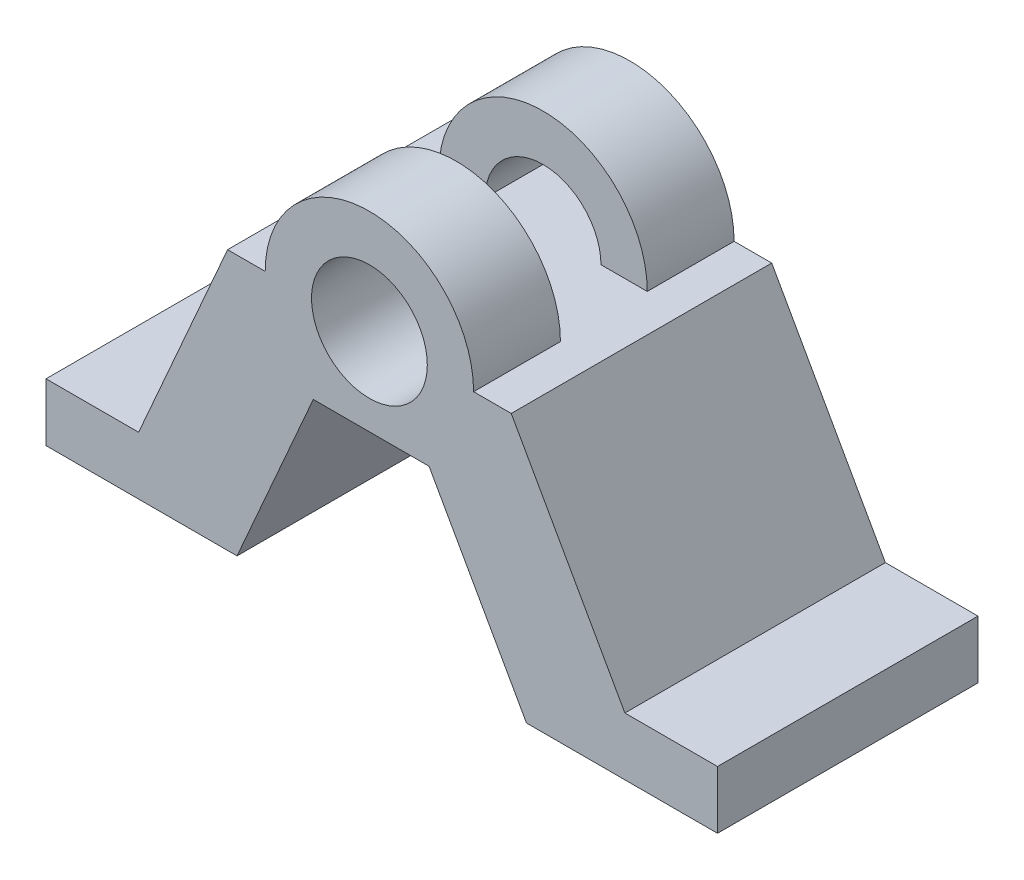
ISO-10303-21;
HEADER;
FILE_DESCRIPTION(('STEP AP214'),'2;1');
FILE_NAME('part.step','',(''),(''),'','','');
FILE_SCHEMA(('AUTOMOTIVE_DESIGN { 1 0 10303 214 1 1 1 1 }'));
ENDSEC;
DATA;
#1=APPLICATION_CONTEXT('core data for automotive mechanical design processes');
#2=APPLICATION_PROTOCOL_DEFINITION('international standard','automotive_design',2000,#1);
#3=PRODUCT_CONTEXT('',#1,'mechanical');
#4=PRODUCT('Part','Part','',(#3));
#5=PRODUCT_RELATED_PRODUCT_CATEGORY('part','',(#4));
#6=PRODUCT_DEFINITION_FORMATION('','',#4);
#7=PRODUCT_DEFINITION_CONTEXT('part definition',#1,'design');
#8=PRODUCT_DEFINITION('design','',#6,#7);
#9=PRODUCT_DEFINITION_SHAPE('','',#8);
#10=(LENGTH_UNIT() NAMED_UNIT(*) SI_UNIT(.MILLI.,.METRE.));
#11=(NAMED_UNIT(*) PLANE_ANGLE_UNIT() SI_UNIT($,.RADIAN.));
#12=(NAMED_UNIT(*) SI_UNIT($,.STERADIAN.) SOLID_ANGLE_UNIT());
#13=UNCERTAINTY_MEASURE_WITH_UNIT(LENGTH_MEASURE(1.E-05),#10,'distance_accuracy_value','');
#14=(GEOMETRIC_REPRESENTATION_CONTEXT(3) GLOBAL_UNCERTAINTY_ASSIGNED_CONTEXT((#13)) GLOBAL_UNIT_ASSIGNED_CONTEXT((#10,
#11,#12)) REPRESENTATION_CONTEXT('',''));
#15=CARTESIAN_POINT('',(0.,0.,0.));
#16=DIRECTION('',(0.,0.,1.));
#17=DIRECTION('',(1.,0.,0.));
#18=AXIS2_PLACEMENT_3D('',#15,#16,#17);
#19=CARTESIAN_POINT('',(0.,35.,-30.));
#20=DIRECTION('',(0.,-1.,0.));
#21=DIRECTION('',(1.,0.,0.));
#22=AXIS2_PLACEMENT_3D('',#19,#20,#21);
#23=PLANE('',#22);
#24=DIRECTION('',(-1.,0.,0.));
#25=VECTOR('',#24,1.);
#26=CARTESIAN_POINT('',(0.,35.,-15.));
#27=LINE('',#26,#25);
#28=CARTESIAN_POINT('',(2.69339881732652,35.,-15.));
#29=VERTEX_POINT('',#28);
#30=CARTESIAN_POINT('',(-17.3066011826735,35.,-15.));
#31=VERTEX_POINT('',#30);
#32=EDGE_CURVE('E169',#29,#31,#27,.T.);
#33=ORIENTED_EDGE('',*,*,#32,.F.);
#34=DIRECTION('',(-1.,0.,0.));
#35=VECTOR('',#34,1.);
#36=CARTESIAN_POINT('',(0.,35.,-15.));
#37=LINE('',#36,#35);
#38=CARTESIAN_POINT('',(10.6933988173265,35.,-15.));
#39=VERTEX_POINT('',#38);
#40=EDGE_CURVE('E188',#39,#29,#37,.T.);
#41=ORIENTED_EDGE('',*,*,#40,.F.);
#42=DIRECTION('',(0.,0.,1.));
#43=VECTOR('',#42,1.);
#44=CARTESIAN_POINT('',(10.6933988173265,35.,-15.));
#45=LINE('',#44,#43);
#46=CARTESIAN_POINT('',(10.6933988173265,35.,0.));
#47=VERTEX_POINT('',#46);
#48=EDGE_CURVE('E204',#39,#47,#45,.T.);
#49=ORIENTED_EDGE('',*,*,#48,.T.);
#50=DIRECTION('',(1.,0.,0.));
#51=VECTOR('',#50,1.);
#52=CARTESIAN_POINT('',(0.,35.,0.));
#53=LINE('',#52,#51);
#54=CARTESIAN_POINT('',(17.1933988173265,35.,0.));
#55=VERTEX_POINT('',#54);
#56=EDGE_CURVE('E207',#47,#55,#53,.T.);
#57=ORIENTED_EDGE('',*,*,#56,.T.);
#58=DIRECTION('',(0.,0.,1.));
#59=VECTOR('',#58,1.);
#60=CARTESIAN_POINT('',(17.1933988173265,35.,-30.));
#61=LINE('',#60,#59);
#62=CARTESIAN_POINT('',(17.1933988173265,35.,-45.));
#63=VERTEX_POINT('',#62);
#64=EDGE_CURVE('E47',#63,#55,#61,.T.);
#65=ORIENTED_EDGE('',*,*,#64,.F.);
#66=DIRECTION('',(1.,0.,0.));
#67=VECTOR('',#66,1.);
#68=CARTESIAN_POINT('',(0.,35.,-45.));
#69=LINE('',#68,#67);
#70=CARTESIAN_POINT('',(10.6933988173265,35.,-45.));
#71=VERTEX_POINT('',#70);
#72=EDGE_CURVE('E301',#71,#63,#69,.T.);
#73=ORIENTED_EDGE('',*,*,#72,.F.);
#74=DIRECTION('',(0.,0.,-1.));
#75=VECTOR('',#74,1.);
#76=CARTESIAN_POINT('',(10.6933988173265,35.,-30.));
#77=LINE('',#76,#75);
#78=CARTESIAN_POINT('',(10.6933988173265,35.,-30.));
#79=VERTEX_POINT('',#78);
#80=EDGE_CURVE('E334',#79,#71,#77,.T.);
#81=ORIENTED_EDGE('',*,*,#80,.F.);
#82=DIRECTION('',(-1.,0.,0.));
#83=VECTOR('',#82,1.);
#84=CARTESIAN_POINT('',(0.,35.,-30.));
#85=LINE('',#84,#83);
#86=CARTESIAN_POINT('',(2.69339881732652,35.,-30.));
#87=VERTEX_POINT('',#86);
#88=EDGE_CURVE('E344',#79,#87,#85,.T.);
#89=ORIENTED_EDGE('',*,*,#88,.T.);
#90=DIRECTION('',(0.,0.,1.));
#91=VECTOR('',#90,1.);
#92=CARTESIAN_POINT('',(2.69339881732652,35.,-45.));
#93=LINE('',#92,#91);
#94=CARTESIAN_POINT('',(2.69339881732652,35.,-45.));
#95=VERTEX_POINT('',#94);
#96=EDGE_CURVE('E61',#95,#87,#93,.T.);
#97=ORIENTED_EDGE('',*,*,#96,.F.);
#98=DIRECTION('',(1.,0.,0.));
#99=VECTOR('',#98,1.);
#100=CARTESIAN_POINT('',(0.,35.,-45.));
#101=LINE('',#100,#99);
#102=CARTESIAN_POINT('',(-17.3066011826735,35.,-45.));
#103=VERTEX_POINT('',#102);
#104=EDGE_CURVE('E54',#103,#95,#101,.T.);
#105=ORIENTED_EDGE('',*,*,#104,.F.);
#106=DIRECTION('',(0.,0.,1.));
#107=VECTOR('',#106,1.);
#108=CARTESIAN_POINT('',(-17.3066011826735,35.,-45.));
#109=LINE('',#108,#107);
#110=CARTESIAN_POINT('',(-17.3066011826735,35.,-30.));
#111=VERTEX_POINT('',#110);
#112=EDGE_CURVE('E190',#103,#111,#109,.T.);
#113=ORIENTED_EDGE('',*,*,#112,.T.);
#114=CARTESIAN_POINT('',(-25.3066011826735,35.,-30.));
#115=VERTEX_POINT('',#114);
#116=EDGE_CURVE('E331',#111,#115,#85,.T.);
#117=ORIENTED_EDGE('',*,*,#116,.T.);
#118=DIRECTION('',(0.,0.,-1.));
#119=VECTOR('',#118,1.);
#120=CARTESIAN_POINT('',(-25.3066011826735,35.,-30.));
#121=LINE('',#120,#119);
#122=CARTESIAN_POINT('',(-25.3066011826735,35.,-45.));
#123=VERTEX_POINT('',#122);
#124=EDGE_CURVE('E340',#115,#123,#121,.T.);
#125=ORIENTED_EDGE('',*,*,#124,.T.);
#126=CARTESIAN_POINT('',(-31.8066011826735,35.,-45.));
#127=VERTEX_POINT('',#126);
#128=EDGE_CURVE('E270',#127,#123,#69,.T.);
#129=ORIENTED_EDGE('',*,*,#128,.F.);
#130=DIRECTION('',(0.,0.,1.));
#131=VECTOR('',#130,1.);
#132=CARTESIAN_POINT('',(-31.8066011826735,35.,-30.));
#133=LINE('',#132,#131);
#134=CARTESIAN_POINT('',(-31.8066011826735,35.,0.));
#135=VERTEX_POINT('',#134);
#136=EDGE_CURVE('E245',#127,#135,#133,.T.);
#137=ORIENTED_EDGE('',*,*,#136,.T.);
#138=CARTESIAN_POINT('',(-25.3066011826735,35.,0.));
#139=VERTEX_POINT('',#138);
#140=EDGE_CURVE('E210',#135,#139,#53,.T.);
#141=ORIENTED_EDGE('',*,*,#140,.T.);
#142=DIRECTION('',(0.,0.,1.));
#143=VECTOR('',#142,1.);
#144=CARTESIAN_POINT('',(-25.3066011826735,35.,-15.));
#145=LINE('',#144,#143);
#146=CARTESIAN_POINT('',(-25.3066011826735,35.,-15.));
#147=VERTEX_POINT('',#146);
#148=EDGE_CURVE('E193',#147,#139,#145,.T.);
#149=ORIENTED_EDGE('',*,*,#148,.F.);
#150=EDGE_CURVE('E186',#31,#147,#37,.T.);
#151=ORIENTED_EDGE('',*,*,#150,.F.);
#152=EDGE_LOOP('',(#33,#41,#49,#57,#65,#73,#81,#89,#97,#105,#113,#117,#125,#129,#137,#141,#149,#151));
#153=FACE_BOUND('',#152,.T.);
#154=ADVANCED_FACE('F40',(#153),#23,.F.);
#155=CARTESIAN_POINT('',(28.0121002213759,15.7124172733471,-30.));
#156=DIRECTION('',(0.872165462247695,0.489211004028184,0.));
#157=DIRECTION('',(-0.489211004028184,0.872165462247695,0.));
#158=AXIS2_PLACEMENT_3D('',#155,#156,#157);
#159=PLANE('',#158);
#160=ORIENTED_EDGE('',*,*,#64,.T.);
#161=DIRECTION('',(-0.489211004028184,0.872165462247695,0.));
#162=VECTOR('',#161,1.);
#163=CARTESIAN_POINT('',(28.0121002213759,15.7124172733471,0.));
#164=LINE('',#163,#162);
#165=CARTESIAN_POINT('',(36.8254364089776,0.,0.));
#166=VERTEX_POINT('',#165);
#167=EDGE_CURVE('E242',#166,#55,#164,.T.);
#168=ORIENTED_EDGE('',*,*,#167,.F.);
#169=DIRECTION('',(0.,0.,1.));
#170=VECTOR('',#169,1.);
#171=CARTESIAN_POINT('',(36.8254364089776,0.,-30.));
#172=LINE('',#171,#170);
#173=CARTESIAN_POINT('',(36.8254364089776,0.,-45.));
#174=VERTEX_POINT('',#173);
#175=EDGE_CURVE('E247',#174,#166,#172,.T.);
#176=ORIENTED_EDGE('',*,*,#175,.F.);
#177=DIRECTION('',(-0.489211004028184,0.872165462247695,0.));
#178=VECTOR('',#177,1.);
#179=CARTESIAN_POINT('',(28.0121002213759,15.7124172733471,-45.));
#180=LINE('',#179,#178);
#181=EDGE_CURVE('E294',#174,#63,#180,.T.);
#182=ORIENTED_EDGE('',*,*,#181,.T.);
#183=EDGE_LOOP('',(#160,#168,#176,#182));
#184=FACE_BOUND('',#183,.T.);
#185=ADVANCED_FACE('F291',(#184),#159,.T.);
#186=CARTESIAN_POINT('',(0.,0.,-30.));
#187=DIRECTION('',(0.,1.,0.));
#188=DIRECTION('',(-1.,0.,0.));
#189=AXIS2_PLACEMENT_3D('',#186,#187,#188);
#190=PLANE('',#189);
#191=ORIENTED_EDGE('',*,*,#175,.T.);
#192=DIRECTION('',(-1.,0.,0.));
#193=VECTOR('',#192,1.);
#194=CARTESIAN_POINT('',(0.,0.,0.));
#195=LINE('',#194,#193);
#196=CARTESIAN_POINT('',(52.8254364089776,0.,0.));
#197=VERTEX_POINT('',#196);
#198=EDGE_CURVE('E239',#197,#166,#195,.T.);
#199=ORIENTED_EDGE('',*,*,#198,.F.);
#200=DIRECTION('',(0.,0.,1.));
#201=VECTOR('',#200,1.);
#202=CARTESIAN_POINT('',(52.8254364089776,0.,-30.));
#203=LINE('',#202,#201);
#204=CARTESIAN_POINT('',(52.8254364089776,0.,-45.));
#205=VERTEX_POINT('',#204);
#206=EDGE_CURVE('E249',#205,#197,#203,.T.);
#207=ORIENTED_EDGE('',*,*,#206,.F.);
#208=DIRECTION('',(-1.,0.,0.));
#209=VECTOR('',#208,1.);
#210=CARTESIAN_POINT('',(0.,0.,-45.));
#211=LINE('',#210,#209);
#212=EDGE_CURVE('E297',#205,#174,#211,.T.);
#213=ORIENTED_EDGE('',*,*,#212,.T.);
#214=EDGE_LOOP('',(#191,#199,#207,#213));
#215=FACE_BOUND('',#214,.T.);
#216=ADVANCED_FACE('F370',(#215),#190,.T.);
#217=CARTESIAN_POINT('',(52.8254364089776,0.,-30.));
#218=DIRECTION('',(-1.,0.,0.));
#219=DIRECTION('',(0.,0.,1.));
#220=AXIS2_PLACEMENT_3D('',#217,#218,#219);
#221=PLANE('',#220);
#222=ORIENTED_EDGE('',*,*,#206,.T.);
#223=DIRECTION('',(0.,-1.,0.));
#224=VECTOR('',#223,1.);
#225=CARTESIAN_POINT('',(52.8254364089776,0.,0.));
#226=LINE('',#225,#224);
#227=CARTESIAN_POINT('',(52.8254364089776,-9.99999999999997,0.));
#228=VERTEX_POINT('',#227);
#229=EDGE_CURVE('E236',#197,#228,#226,.T.);
#230=ORIENTED_EDGE('',*,*,#229,.T.);
#231=DIRECTION('',(0.,0.,1.));
#232=VECTOR('',#231,1.);
#233=CARTESIAN_POINT('',(52.8254364089776,-9.99999999999997,-30.));
#234=LINE('',#233,#232);
#235=CARTESIAN_POINT('',(52.8254364089776,-9.99999999999997,-45.));
#236=VERTEX_POINT('',#235);
#237=EDGE_CURVE('E251',#236,#228,#234,.T.);
#238=ORIENTED_EDGE('',*,*,#237,.F.);
#239=DIRECTION('',(0.,-1.,0.));
#240=VECTOR('',#239,1.);
#241=CARTESIAN_POINT('',(52.8254364089776,0.,-45.));
#242=LINE('',#241,#240);
#243=EDGE_CURVE('E299',#205,#236,#242,.T.);
#244=ORIENTED_EDGE('',*,*,#243,.F.);
#245=EDGE_LOOP('',(#222,#230,#238,#244));
#246=FACE_BOUND('',#245,.T.);
#247=ADVANCED_FACE('F375',(#246),#221,.F.);
#248=CARTESIAN_POINT('',(0.,-9.99999999999999,-30.));
#249=DIRECTION('',(0.,1.,0.));
#250=DIRECTION('',(-1.,0.,0.));
#251=AXIS2_PLACEMENT_3D('',#248,#249,#250);
#252=PLANE('',#251);
#253=ORIENTED_EDGE('',*,*,#237,.T.);
#254=DIRECTION('',(-1.,0.,0.));
#255=VECTOR('',#254,1.);
#256=CARTESIAN_POINT('',(0.,-9.99999999999999,0.));
#257=LINE('',#256,#255);
#258=CARTESIAN_POINT('',(19.8254364089776,-9.99999999999998,0.));
#259=VERTEX_POINT('',#258);
#260=EDGE_CURVE('E233',#228,#259,#257,.T.);
#261=ORIENTED_EDGE('',*,*,#260,.T.);
#262=DIRECTION('',(0.,0.,1.));
#263=VECTOR('',#262,1.);
#264=CARTESIAN_POINT('',(19.8254364089776,-9.99999999999998,-30.));
#265=LINE('',#264,#263);
#266=CARTESIAN_POINT('',(19.8254364089776,-9.99999999999998,-45.));
#267=VERTEX_POINT('',#266);
#268=EDGE_CURVE('E253',#267,#259,#265,.T.);
#269=ORIENTED_EDGE('',*,*,#268,.F.);
#270=DIRECTION('',(-1.,0.,0.));
#271=VECTOR('',#270,1.);
#272=CARTESIAN_POINT('',(0.,-9.99999999999999,-45.));
#273=LINE('',#272,#271);
#274=EDGE_CURVE('E307',#236,#267,#273,.T.);
#275=ORIENTED_EDGE('',*,*,#274,.F.);
#276=EDGE_LOOP('',(#253,#261,#269,#275));
#277=FACE_BOUND('',#276,.T.);
#278=ADVANCED_FACE('F383',(#277),#252,.F.);
#279=CARTESIAN_POINT('',(10.8139367165854,6.06570320382115,-30.));
#280=DIRECTION('',(0.872165462247695,0.489211004028184,0.));
#281=DIRECTION('',(-0.489211004028184,0.872165462247695,0.));
#282=AXIS2_PLACEMENT_3D('',#279,#280,#281);
#283=PLANE('',#282);
#284=ORIENTED_EDGE('',*,*,#268,.T.);
#285=DIRECTION('',(-0.489211004028185,0.872165462247695,0.));
#286=VECTOR('',#285,1.);
#287=CARTESIAN_POINT('',(10.8139367165854,6.06570320382115,0.));
#288=LINE('',#287,#286);
#289=CARTESIAN_POINT('',(2.99797561613382,20.,0.));
#290=VERTEX_POINT('',#289);
#291=EDGE_CURVE('E230',#259,#290,#288,.T.);
#292=ORIENTED_EDGE('',*,*,#291,.T.);
#293=DIRECTION('',(0.,0.,1.));
#294=VECTOR('',#293,1.);
#295=CARTESIAN_POINT('',(2.99797561613382,20.,-30.));
#296=LINE('',#295,#294);
#297=CARTESIAN_POINT('',(2.99797561613382,20.,-45.));
#298=VERTEX_POINT('',#297);
#299=EDGE_CURVE('E255',#298,#290,#296,.T.);
#300=ORIENTED_EDGE('',*,*,#299,.F.);
#301=DIRECTION('',(-0.489211004028185,0.872165462247695,0.));
#302=VECTOR('',#301,1.);
#303=CARTESIAN_POINT('',(10.8139367165854,6.06570320382115,-45.));
#304=LINE('',#303,#302);
#305=EDGE_CURVE('E310',#267,#298,#304,.T.);
#306=ORIENTED_EDGE('',*,*,#305,.F.);
#307=EDGE_LOOP('',(#284,#292,#300,#306));
#308=FACE_BOUND('',#307,.T.);
#309=ADVANCED_FACE('F387',(#308),#283,.F.);
#310=CARTESIAN_POINT('',(0.,20.,-30.));
#311=DIRECTION('',(0.,1.,0.));
#312=DIRECTION('',(-1.,0.,0.));
#313=AXIS2_PLACEMENT_3D('',#310,#311,#312);
#314=PLANE('',#313);
#315=ORIENTED_EDGE('',*,*,#299,.T.);
#316=DIRECTION('',(-1.,0.,0.));
#317=VECTOR('',#316,1.);
#318=CARTESIAN_POINT('',(0.,20.,0.));
#319=LINE('',#318,#317);
#320=CARTESIAN_POINT('',(-17.0020243838662,20.,0.));
#321=VERTEX_POINT('',#320);
#322=EDGE_CURVE('E227',#290,#321,#319,.T.);
#323=ORIENTED_EDGE('',*,*,#322,.T.);
#324=DIRECTION('',(0.,0.,1.));
#325=VECTOR('',#324,1.);
#326=CARTESIAN_POINT('',(-17.0020243838662,20.,-30.));
#327=LINE('',#326,#325);
#328=CARTESIAN_POINT('',(-17.0020243838662,20.,-45.));
#329=VERTEX_POINT('',#328);
#330=EDGE_CURVE('E257',#329,#321,#327,.T.);
#331=ORIENTED_EDGE('',*,*,#330,.F.);
#332=DIRECTION('',(-1.,0.,0.));
#333=VECTOR('',#332,1.);
#334=CARTESIAN_POINT('',(0.,20.,-45.));
#335=LINE('',#334,#333);
#336=EDGE_CURVE('E313',#298,#329,#335,.T.);
#337=ORIENTED_EDGE('',*,*,#336,.F.);
#338=EDGE_LOOP('',(#315,#323,#331,#337));
#339=FACE_BOUND('',#338,.T.);
#340=ADVANCED_FACE('F391',(#339),#314,.F.);
#341=CARTESIAN_POINT('',(-21.6162125457353,9.49134690896407,-30.));
#342=DIRECTION('',(-0.915623723413446,0.402036313188868,0.));
#343=DIRECTION('',(-0.402036313188868,-0.915623723413446,0.));
#344=AXIS2_PLACEMENT_3D('',#341,#342,#343);
#345=PLANE('',#344);
#346=ORIENTED_EDGE('',*,*,#330,.T.);
#347=DIRECTION('',(-0.402036313188868,-0.915623723413446,0.));
#348=VECTOR('',#347,1.);
#349=CARTESIAN_POINT('',(-21.6162125457353,9.49134690896407,0.));
#350=LINE('',#349,#348);
#351=CARTESIAN_POINT('',(-30.1745635910224,-10.,0.));
#352=VERTEX_POINT('',#351);
#353=EDGE_CURVE('E224',#321,#352,#350,.T.);
#354=ORIENTED_EDGE('',*,*,#353,.T.);
#355=DIRECTION('',(0.,0.,1.));
#356=VECTOR('',#355,1.);
#357=CARTESIAN_POINT('',(-30.1745635910224,-10.,-30.));
#358=LINE('',#357,#356);
#359=CARTESIAN_POINT('',(-30.1745635910224,-10.,-45.));
#360=VERTEX_POINT('',#359);
#361=EDGE_CURVE('E259',#360,#352,#358,.T.);
#362=ORIENTED_EDGE('',*,*,#361,.F.);
#363=DIRECTION('',(-0.402036313188868,-0.915623723413446,0.));
#364=VECTOR('',#363,1.);
#365=CARTESIAN_POINT('',(-21.6162125457353,9.49134690896407,-45.));
#366=LINE('',#365,#364);
#367=EDGE_CURVE('E316',#329,#360,#366,.T.);
#368=ORIENTED_EDGE('',*,*,#367,.F.);
#369=EDGE_LOOP('',(#346,#354,#362,#368));
#370=FACE_BOUND('',#369,.T.);
#371=ADVANCED_FACE('F395',(#370),#345,.F.);
#372=CARTESIAN_POINT('',(0.,-10.,-30.));
#373=DIRECTION('',(0.,1.,0.));
#374=DIRECTION('',(-1.,0.,0.));
#375=AXIS2_PLACEMENT_3D('',#372,#373,#374);
#376=PLANE('',#375);
#377=ORIENTED_EDGE('',*,*,#361,.T.);
#378=DIRECTION('',(-1.,0.,0.));
#379=VECTOR('',#378,1.);
#380=CARTESIAN_POINT('',(0.,-10.,0.));
#381=LINE('',#380,#379);
#382=CARTESIAN_POINT('',(-63.1745635910225,-10.,0.));
#383=VERTEX_POINT('',#382);
#384=EDGE_CURVE('E221',#352,#383,#381,.T.);
#385=ORIENTED_EDGE('',*,*,#384,.T.);
#386=DIRECTION('',(0.,0.,1.));
#387=VECTOR('',#386,1.);
#388=CARTESIAN_POINT('',(-63.1745635910225,-10.,-30.));
#389=LINE('',#388,#387);
#390=CARTESIAN_POINT('',(-63.1745635910225,-10.,-45.));
#391=VERTEX_POINT('',#390);
#392=EDGE_CURVE('E261',#391,#383,#389,.T.);
#393=ORIENTED_EDGE('',*,*,#392,.F.);
#394=DIRECTION('',(-1.,0.,0.));
#395=VECTOR('',#394,1.);
#396=CARTESIAN_POINT('',(0.,-10.,-45.));
#397=LINE('',#396,#395);
#398=EDGE_CURVE('E319',#360,#391,#397,.T.);
#399=ORIENTED_EDGE('',*,*,#398,.F.);
#400=EDGE_LOOP('',(#377,#385,#393,#399));
#401=FACE_BOUND('',#400,.T.);
#402=ADVANCED_FACE('F399',(#401),#376,.F.);
#403=CARTESIAN_POINT('',(-63.1745635910225,0.,-30.));
#404=DIRECTION('',(1.,0.,0.));
#405=DIRECTION('',(0.,0.,-1.));
#406=AXIS2_PLACEMENT_3D('',#403,#404,#405);
#407=PLANE('',#406);
#408=ORIENTED_EDGE('',*,*,#392,.T.);
#409=DIRECTION('',(0.,1.,0.));
#410=VECTOR('',#409,1.);
#411=CARTESIAN_POINT('',(-63.1745635910225,0.,0.));
#412=LINE('',#411,#410);
#413=CARTESIAN_POINT('',(-63.1745635910225,0.,0.));
#414=VERTEX_POINT('',#413);
#415=EDGE_CURVE('E218',#383,#414,#412,.T.);
#416=ORIENTED_EDGE('',*,*,#415,.T.);
#417=DIRECTION('',(0.,0.,1.));
#418=VECTOR('',#417,1.);
#419=CARTESIAN_POINT('',(-63.1745635910225,0.,-30.));
#420=LINE('',#419,#418);
#421=CARTESIAN_POINT('',(-63.1745635910225,0.,-45.));
#422=VERTEX_POINT('',#421);
#423=EDGE_CURVE('E263',#422,#414,#420,.T.);
#424=ORIENTED_EDGE('',*,*,#423,.F.);
#425=DIRECTION('',(0.,1.,0.));
#426=VECTOR('',#425,1.);
#427=CARTESIAN_POINT('',(-63.1745635910225,0.,-45.));
#428=LINE('',#427,#426);
#429=EDGE_CURVE('E322',#391,#422,#428,.T.);
#430=ORIENTED_EDGE('',*,*,#429,.F.);
#431=EDGE_LOOP('',(#408,#416,#424,#430));
#432=FACE_BOUND('',#431,.T.);
#433=ADVANCED_FACE('F403',(#432),#407,.F.);
#434=CARTESIAN_POINT('',(0.,0.,-30.));
#435=DIRECTION('',(0.,-1.,0.));
#436=DIRECTION('',(0.,0.,-1.));
#437=AXIS2_PLACEMENT_3D('',#434,#435,#436);
#438=PLANE('',#437);
#439=ORIENTED_EDGE('',*,*,#423,.T.);
#440=DIRECTION('',(1.,0.,0.));
#441=VECTOR('',#440,1.);
#442=CARTESIAN_POINT('',(0.,0.,0.));
#443=LINE('',#442,#441);
#444=CARTESIAN_POINT('',(-47.1745635910225,0.,0.));
#445=VERTEX_POINT('',#444);
#446=EDGE_CURVE('E215',#414,#445,#443,.T.);
#447=ORIENTED_EDGE('',*,*,#446,.T.);
#448=DIRECTION('',(0.,0.,1.));
#449=VECTOR('',#448,1.);
#450=CARTESIAN_POINT('',(-47.1745635910225,0.,-30.));
#451=LINE('',#450,#449);
#452=CARTESIAN_POINT('',(-47.1745635910225,0.,-45.));
#453=VERTEX_POINT('',#452);
#454=EDGE_CURVE('E265',#453,#445,#451,.T.);
#455=ORIENTED_EDGE('',*,*,#454,.F.);
#456=DIRECTION('',(1.,0.,0.));
#457=VECTOR('',#456,1.);
#458=CARTESIAN_POINT('',(0.,0.,-45.));
#459=LINE('',#458,#457);
#460=EDGE_CURVE('E324',#422,#453,#459,.T.);
#461=ORIENTED_EDGE('',*,*,#460,.F.);
#462=EDGE_LOOP('',(#439,#447,#455,#461));
#463=FACE_BOUND('',#462,.T.);
#464=ADVANCED_FACE('F407',(#463),#438,.F.);
#465=CARTESIAN_POINT('',(-39.5495880549469,17.3656166426889,-30.));
#466=DIRECTION('',(0.915623723413446,-0.402036313188868,0.));
#467=DIRECTION('',(0.402036313188868,0.915623723413446,0.));
#468=AXIS2_PLACEMENT_3D('',#465,#466,#467);
#469=PLANE('',#468);
#470=ORIENTED_EDGE('',*,*,#454,.T.);
#471=DIRECTION('',(0.402036313188868,0.915623723413446,0.));
#472=VECTOR('',#471,1.);
#473=CARTESIAN_POINT('',(-39.5495880549469,17.3656166426889,0.));
#474=LINE('',#473,#472);
#475=EDGE_CURVE('E212',#445,#135,#474,.T.);
#476=ORIENTED_EDGE('',*,*,#475,.T.);
#477=ORIENTED_EDGE('',*,*,#136,.F.);
#478=DIRECTION('',(0.402036313188868,0.915623723413446,0.));
#479=VECTOR('',#478,1.);
#480=CARTESIAN_POINT('',(-39.5495880549469,17.3656166426889,-45.));
#481=LINE('',#480,#479);
#482=EDGE_CURVE('E199',#453,#127,#481,.T.);
#483=ORIENTED_EDGE('',*,*,#482,.F.);
#484=EDGE_LOOP('',(#470,#476,#477,#483));
#485=FACE_BOUND('',#484,.T.);
#486=ADVANCED_FACE('F275',(#485),#469,.F.);
#487=CARTESIAN_POINT('',(0.,0.,0.));
#488=DIRECTION('',(0.,0.,1.));
#489=DIRECTION('',(1.,0.,0.));
#490=AXIS2_PLACEMENT_3D('',#487,#488,#489);
#491=PLANE('',#490);
#492=CARTESIAN_POINT('',(-7.30660118267348,35.,0.));
#493=DIRECTION('',(0.,0.,1.));
#494=DIRECTION('',(1.,0.,0.));
#495=AXIS2_PLACEMENT_3D('',#492,#493,#494);
#496=CIRCLE('',#495,10.);
#497=CARTESIAN_POINT('',(2.69339881732652,35.,0.));
#498=VERTEX_POINT('',#497);
#499=EDGE_CURVE('E181',#498,#498,#496,.T.);
#500=ORIENTED_EDGE('',*,*,#499,.F.);
#501=EDGE_LOOP('',(#500));
#502=FACE_BOUND('',#501,.T.);
#503=ORIENTED_EDGE('',*,*,#140,.F.);
#504=ORIENTED_EDGE('',*,*,#475,.F.);
#505=ORIENTED_EDGE('',*,*,#446,.F.);
#506=ORIENTED_EDGE('',*,*,#415,.F.);
#507=ORIENTED_EDGE('',*,*,#384,.F.);
#508=ORIENTED_EDGE('',*,*,#353,.F.);
#509=ORIENTED_EDGE('',*,*,#322,.F.);
#510=ORIENTED_EDGE('',*,*,#291,.F.);
#511=ORIENTED_EDGE('',*,*,#260,.F.);
#512=ORIENTED_EDGE('',*,*,#229,.F.);
#513=ORIENTED_EDGE('',*,*,#198,.T.);
#514=ORIENTED_EDGE('',*,*,#167,.T.);
#515=ORIENTED_EDGE('',*,*,#56,.F.);
#516=CARTESIAN_POINT('',(-7.30660118267348,35.,0.));
#517=DIRECTION('',(0.,0.,1.));
#518=DIRECTION('',(1.,0.,0.));
#519=AXIS2_PLACEMENT_3D('',#516,#517,#518);
#520=CIRCLE('',#519,18.);
#521=EDGE_CURVE('E195',#47,#139,#520,.T.);
#522=ORIENTED_EDGE('',*,*,#521,.T.);
#523=EDGE_LOOP('',(#503,#504,#505,#506,#507,#508,#509,#510,#511,#512,#513,#514,#515,#522));
#524=FACE_BOUND('',#523,.T.);
#525=ADVANCED_FACE('F278',(#502,#524),#491,.T.);
#526=CARTESIAN_POINT('',(-7.30660118267348,35.,-15.));
#527=DIRECTION('',(0.,0.,1.));
#528=DIRECTION('',(1.,0.,0.));
#529=AXIS2_PLACEMENT_3D('',#526,#527,#528);
#530=CYLINDRICAL_SURFACE('',#529,18.);
#531=ORIENTED_EDGE('',*,*,#521,.F.);
#532=ORIENTED_EDGE('',*,*,#48,.F.);
#533=CARTESIAN_POINT('',(-7.30660118267348,35.,-15.));
#534=DIRECTION('',(0.,0.,1.));
#535=DIRECTION('',(1.,0.,0.));
#536=AXIS2_PLACEMENT_3D('',#533,#534,#535);
#537=CIRCLE('',#536,18.);
#538=EDGE_CURVE('E197',#39,#147,#537,.T.);
#539=ORIENTED_EDGE('',*,*,#538,.T.);
#540=ORIENTED_EDGE('',*,*,#148,.T.);
#541=EDGE_LOOP('',(#531,#532,#539,#540));
#542=FACE_BOUND('',#541,.T.);
#543=ADVANCED_FACE('F283',(#542),#530,.T.);
#544=CARTESIAN_POINT('',(0.,0.,-15.));
#545=DIRECTION('',(0.,0.,1.));
#546=DIRECTION('',(1.,0.,0.));
#547=AXIS2_PLACEMENT_3D('',#544,#545,#546);
#548=PLANE('',#547);
#549=ORIENTED_EDGE('',*,*,#40,.T.);
#550=CARTESIAN_POINT('',(-7.30660118267348,35.,-15.));
#551=DIRECTION('',(0.,0.,1.));
#552=DIRECTION('',(1.,0.,0.));
#553=AXIS2_PLACEMENT_3D('',#550,#551,#552);
#554=CIRCLE('',#553,10.);
#555=EDGE_CURVE('E179',#29,#31,#554,.T.);
#556=ORIENTED_EDGE('',*,*,#555,.T.);
#557=ORIENTED_EDGE('',*,*,#150,.T.);
#558=ORIENTED_EDGE('',*,*,#538,.F.);
#559=EDGE_LOOP('',(#549,#556,#557,#558));
#560=FACE_BOUND('',#559,.T.);
#561=ADVANCED_FACE('F184',(#560),#548,.F.);
#562=CARTESIAN_POINT('',(0.,0.,-45.));
#563=DIRECTION('',(0.,0.,-1.));
#564=DIRECTION('',(1.,0.,0.));
#565=AXIS2_PLACEMENT_3D('',#562,#563,#564);
#566=PLANE('',#565);
#567=ORIENTED_EDGE('',*,*,#104,.T.);
#568=CARTESIAN_POINT('',(-7.30660118267348,35.,-45.));
#569=DIRECTION('',(0.,0.,1.));
#570=DIRECTION('',(1.,0.,0.));
#571=AXIS2_PLACEMENT_3D('',#568,#569,#570);
#572=CIRCLE('',#571,10.);
#573=EDGE_CURVE('E347',#95,#103,#572,.T.);
#574=ORIENTED_EDGE('',*,*,#573,.T.);
#575=EDGE_LOOP('',(#567,#574));
#576=FACE_BOUND('',#575,.T.);
#577=ORIENTED_EDGE('',*,*,#128,.T.);
#578=CARTESIAN_POINT('',(-7.30660118267348,35.,-45.));
#579=DIRECTION('',(0.,0.,1.));
#580=DIRECTION('',(1.,0.,0.));
#581=AXIS2_PLACEMENT_3D('',#578,#579,#580);
#582=CIRCLE('',#581,18.);
#583=EDGE_CURVE('E189',#71,#123,#582,.T.);
#584=ORIENTED_EDGE('',*,*,#583,.F.);
#585=ORIENTED_EDGE('',*,*,#72,.T.);
#586=ORIENTED_EDGE('',*,*,#181,.F.);
#587=ORIENTED_EDGE('',*,*,#212,.F.);
#588=ORIENTED_EDGE('',*,*,#243,.T.);
#589=ORIENTED_EDGE('',*,*,#274,.T.);
#590=ORIENTED_EDGE('',*,*,#305,.T.);
#591=ORIENTED_EDGE('',*,*,#336,.T.);
#592=ORIENTED_EDGE('',*,*,#367,.T.);
#593=ORIENTED_EDGE('',*,*,#398,.T.);
#594=ORIENTED_EDGE('',*,*,#429,.T.);
#595=ORIENTED_EDGE('',*,*,#460,.T.);
#596=ORIENTED_EDGE('',*,*,#482,.T.);
#597=EDGE_LOOP('',(#577,#584,#585,#586,#587,#588,#589,#590,#591,#592,#593,#594,#595,#596));
#598=FACE_BOUND('',#597,.T.);
#599=ADVANCED_FACE('F327',(#576,#598),#566,.T.);
#600=CARTESIAN_POINT('',(-7.30660118267348,35.,-30.));
#601=DIRECTION('',(0.,0.,-1.));
#602=DIRECTION('',(-1.,0.,0.));
#603=AXIS2_PLACEMENT_3D('',#600,#601,#602);
#604=CYLINDRICAL_SURFACE('',#603,18.);
#605=ORIENTED_EDGE('',*,*,#583,.T.);
#606=ORIENTED_EDGE('',*,*,#124,.F.);
#607=CARTESIAN_POINT('',(-7.30660118267348,35.,-30.));
#608=DIRECTION('',(0.,0.,1.));
#609=DIRECTION('',(1.,0.,0.));
#610=AXIS2_PLACEMENT_3D('',#607,#608,#609);
#611=CIRCLE('',#610,18.);
#612=EDGE_CURVE('E337',#79,#115,#611,.T.);
#613=ORIENTED_EDGE('',*,*,#612,.F.);
#614=ORIENTED_EDGE('',*,*,#80,.T.);
#615=EDGE_LOOP('',(#605,#606,#613,#614));
#616=FACE_BOUND('',#615,.T.);
#617=ADVANCED_FACE('F335',(#616),#604,.T.);
#618=CARTESIAN_POINT('',(0.,0.,-30.));
#619=DIRECTION('',(0.,0.,-1.));
#620=DIRECTION('',(1.,0.,0.));
#621=AXIS2_PLACEMENT_3D('',#618,#619,#620);
#622=PLANE('',#621);
#623=ORIENTED_EDGE('',*,*,#116,.F.);
#624=CARTESIAN_POINT('',(-7.30660118267348,35.,-30.));
#625=DIRECTION('',(0.,0.,-1.));
#626=DIRECTION('',(-1.,0.,0.));
#627=AXIS2_PLACEMENT_3D('',#624,#625,#626);
#628=CIRCLE('',#627,10.);
#629=EDGE_CURVE('E12',#111,#87,#628,.T.);
#630=ORIENTED_EDGE('',*,*,#629,.T.);
#631=ORIENTED_EDGE('',*,*,#88,.F.);
#632=ORIENTED_EDGE('',*,*,#612,.T.);
#633=EDGE_LOOP('',(#623,#630,#631,#632));
#634=FACE_BOUND('',#633,.T.);
#635=ADVANCED_FACE('F357',(#634),#622,.F.);
#636=CARTESIAN_POINT('',(-7.30660118267348,35.,-45.));
#637=DIRECTION('',(0.,0.,1.));
#638=DIRECTION('',(1.,0.,0.));
#639=AXIS2_PLACEMENT_3D('',#636,#637,#638);
#640=CYLINDRICAL_SURFACE('',#639,10.);
#641=ORIENTED_EDGE('',*,*,#112,.F.);
#642=ORIENTED_EDGE('',*,*,#573,.F.);
#643=ORIENTED_EDGE('',*,*,#96,.T.);
#644=ORIENTED_EDGE('',*,*,#629,.F.);
#645=EDGE_LOOP('',(#641,#642,#643,#644));
#646=FACE_BOUND('',#645,.T.);
#647=ADVANCED_FACE('F354',(#646),#640,.F.);
#648=ORIENTED_EDGE('',*,*,#499,.T.);
#649=EDGE_LOOP('',(#648));
#650=FACE_BOUND('',#649,.T.);
#651=ORIENTED_EDGE('',*,*,#555,.F.);
#652=CARTESIAN_POINT('',(-7.30660118267348,35.,-15.));
#653=DIRECTION('',(0.,0.,1.));
#654=DIRECTION('',(1.,0.,0.));
#655=AXIS2_PLACEMENT_3D('',#652,#653,#654);
#656=CIRCLE('',#655,10.);
#657=EDGE_CURVE('E172',#31,#29,#656,.T.);
#658=ORIENTED_EDGE('',*,*,#657,.F.);
#659=EDGE_LOOP('',(#651,#658));
#660=FACE_BOUND('',#659,.T.);
#661=ADVANCED_FACE('F178',(#650,#660),#640,.F.);
#662=CARTESIAN_POINT('',(0.,0.,-15.));
#663=DIRECTION('',(0.,0.,1.));
#664=DIRECTION('',(1.,0.,0.));
#665=AXIS2_PLACEMENT_3D('',#662,#663,#664);
#666=PLANE('',#665);
#667=ORIENTED_EDGE('',*,*,#32,.T.);
#668=ORIENTED_EDGE('',*,*,#657,.T.);
#669=EDGE_LOOP('',(#667,#668));
#670=FACE_BOUND('',#669,.T.);
#671=ADVANCED_FACE('F171',(#670),#666,.T.);
#672=CLOSED_SHELL('',(#154,#185,#216,#247,#278,#309,#340,#371,#402,#433,#464,#486,#525,#543,
#561,#599,#617,#635,#647,#661,#671));
#673=MANIFOLD_SOLID_BREP('B2',#672);
#674=ADVANCED_BREP_SHAPE_REPRESENTATION('',(#18,#673),#14);
#675=SHAPE_DEFINITION_REPRESENTATION(#9,#674);
ENDSEC;
END-ISO-10303-21;
